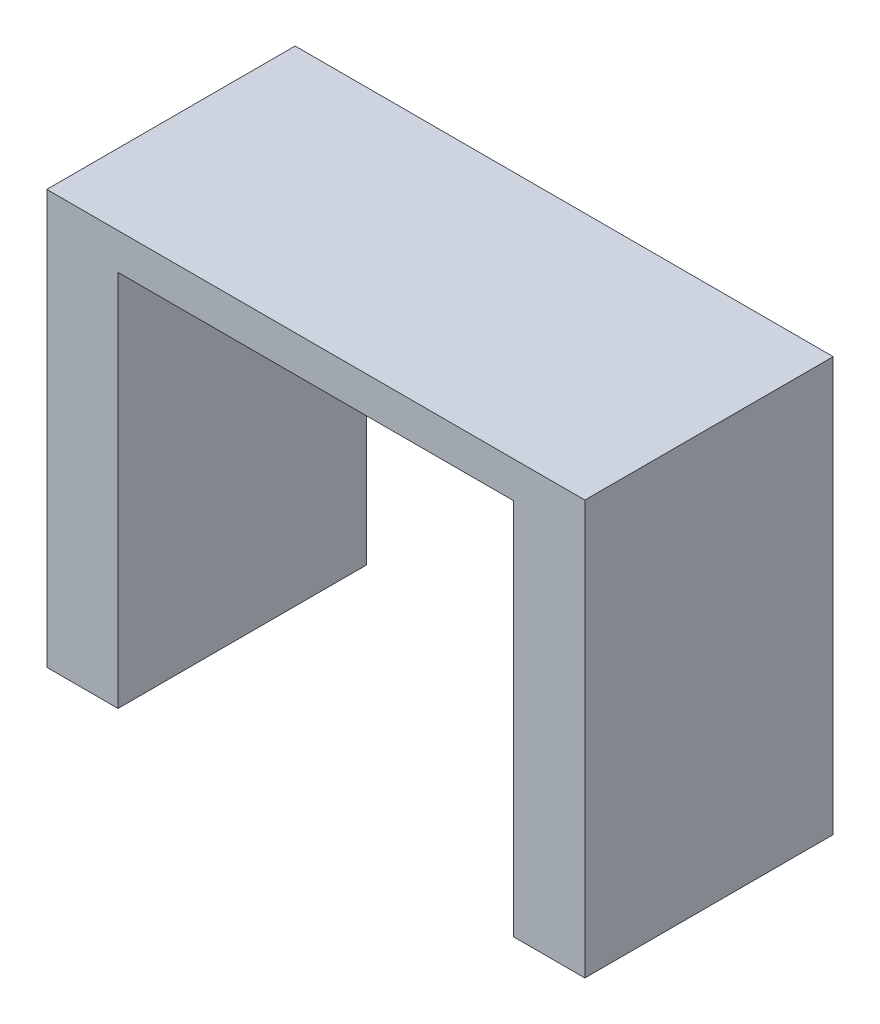
ISO-10303-21;
HEADER;
FILE_DESCRIPTION(('STEP AP214'),'2;1');
FILE_NAME('part.step','',(''),(''),'','','');
FILE_SCHEMA(('AUTOMOTIVE_DESIGN { 1 0 10303 214 1 1 1 1 }'));
ENDSEC;
DATA;
#1=APPLICATION_CONTEXT('core data for automotive mechanical design processes');
#2=APPLICATION_PROTOCOL_DEFINITION('international standard','automotive_design',2000,#1);
#3=PRODUCT_CONTEXT('',#1,'mechanical');
#4=PRODUCT('Part','Part','',(#3));
#5=PRODUCT_RELATED_PRODUCT_CATEGORY('part','',(#4));
#6=PRODUCT_DEFINITION_FORMATION('','',#4);
#7=PRODUCT_DEFINITION_CONTEXT('part definition',#1,'design');
#8=PRODUCT_DEFINITION('design','',#6,#7);
#9=PRODUCT_DEFINITION_SHAPE('','',#8);
#10=(LENGTH_UNIT() NAMED_UNIT(*) SI_UNIT(.MILLI.,.METRE.));
#11=(NAMED_UNIT(*) PLANE_ANGLE_UNIT() SI_UNIT($,.RADIAN.));
#12=(NAMED_UNIT(*) SI_UNIT($,.STERADIAN.) SOLID_ANGLE_UNIT());
#13=UNCERTAINTY_MEASURE_WITH_UNIT(LENGTH_MEASURE(1.E-05),#10,'distance_accuracy_value','');
#14=(GEOMETRIC_REPRESENTATION_CONTEXT(3) GLOBAL_UNCERTAINTY_ASSIGNED_CONTEXT((#13)) GLOBAL_UNIT_ASSIGNED_CONTEXT((#10,
#11,#12)) REPRESENTATION_CONTEXT('',''));
#15=CARTESIAN_POINT('',(0.,0.,0.));
#16=DIRECTION('',(0.,0.,1.));
#17=DIRECTION('',(1.,0.,0.));
#18=AXIS2_PLACEMENT_3D('',#15,#16,#17);
#19=CARTESIAN_POINT('',(0.,0.,0.));
#20=DIRECTION('',(0.,-1.,0.));
#21=DIRECTION('',(0.,0.,-1.));
#22=AXIS2_PLACEMENT_3D('',#19,#20,#21);
#23=PLANE('',#22);
#24=DIRECTION('',(0.,0.,1.));
#25=VECTOR('',#24,1.);
#26=CARTESIAN_POINT('',(4.77865012048486,0.,0.));
#27=LINE('',#26,#25);
#28=CARTESIAN_POINT('',(4.77865012048486,0.,-3.));
#29=VERTEX_POINT('',#28);
#30=CARTESIAN_POINT('',(4.77865012048486,0.,3.));
#31=VERTEX_POINT('',#30);
#32=EDGE_CURVE('E11',#29,#31,#27,.T.);
#33=ORIENTED_EDGE('',*,*,#32,.F.);
#34=DIRECTION('',(-1.,0.,0.));
#35=VECTOR('',#34,1.);
#36=CARTESIAN_POINT('',(-6.5,0.,-3.));
#37=LINE('',#36,#35);
#38=CARTESIAN_POINT('',(6.5,0.,-3.));
#39=VERTEX_POINT('',#38);
#40=EDGE_CURVE('E147',#39,#29,#37,.T.);
#41=ORIENTED_EDGE('',*,*,#40,.F.);
#42=DIRECTION('',(0.,0.,-1.));
#43=VECTOR('',#42,1.);
#44=CARTESIAN_POINT('',(6.5,0.,3.));
#45=LINE('',#44,#43);
#46=CARTESIAN_POINT('',(6.5,0.,3.));
#47=VERTEX_POINT('',#46);
#48=EDGE_CURVE('E135',#47,#39,#45,.T.);
#49=ORIENTED_EDGE('',*,*,#48,.F.);
#50=DIRECTION('',(1.,0.,0.));
#51=VECTOR('',#50,1.);
#52=CARTESIAN_POINT('',(-6.5,0.,3.));
#53=LINE('',#52,#51);
#54=EDGE_CURVE('E78',#31,#47,#53,.T.);
#55=ORIENTED_EDGE('',*,*,#54,.F.);
#56=EDGE_LOOP('',(#33,#41,#49,#55));
#57=FACE_BOUND('',#56,.T.);
#58=ADVANCED_FACE('F33',(#57),#23,.T.);
#59=CARTESIAN_POINT('',(6.5,10.,3.));
#60=DIRECTION('',(-1.,0.,0.));
#61=DIRECTION('',(0.,0.,1.));
#62=AXIS2_PLACEMENT_3D('',#59,#60,#61);
#63=PLANE('',#62);
#64=ORIENTED_EDGE('',*,*,#48,.T.);
#65=DIRECTION('',(0.,-1.,0.));
#66=VECTOR('',#65,1.);
#67=CARTESIAN_POINT('',(6.5,10.,-3.));
#68=LINE('',#67,#66);
#69=CARTESIAN_POINT('',(6.5,10.,-3.));
#70=VERTEX_POINT('',#69);
#71=EDGE_CURVE('E160',#70,#39,#68,.T.);
#72=ORIENTED_EDGE('',*,*,#71,.F.);
#73=DIRECTION('',(0.,0.,-1.));
#74=VECTOR('',#73,1.);
#75=CARTESIAN_POINT('',(6.5,10.,3.));
#76=LINE('',#75,#74);
#77=CARTESIAN_POINT('',(6.5,10.,3.));
#78=VERTEX_POINT('',#77);
#79=EDGE_CURVE('E136',#78,#70,#76,.T.);
#80=ORIENTED_EDGE('',*,*,#79,.F.);
#81=DIRECTION('',(0.,-1.,0.));
#82=VECTOR('',#81,1.);
#83=CARTESIAN_POINT('',(6.5,10.,3.));
#84=LINE('',#83,#82);
#85=EDGE_CURVE('E143',#78,#47,#84,.T.);
#86=ORIENTED_EDGE('',*,*,#85,.T.);
#87=EDGE_LOOP('',(#64,#72,#80,#86));
#88=FACE_BOUND('',#87,.T.);
#89=ADVANCED_FACE('F35',(#88),#63,.F.);
#90=CARTESIAN_POINT('',(-6.5,10.,-3.));
#91=DIRECTION('',(0.,0.,1.));
#92=DIRECTION('',(1.,0.,0.));
#93=AXIS2_PLACEMENT_3D('',#90,#91,#92);
#94=PLANE('',#93);
#95=ORIENTED_EDGE('',*,*,#40,.T.);
#96=DIRECTION('',(0.,1.,0.));
#97=VECTOR('',#96,1.);
#98=CARTESIAN_POINT('',(4.77865012048486,10.,-3.));
#99=LINE('',#98,#97);
#100=CARTESIAN_POINT('',(4.77865012048486,9.1244088288553,-3.));
#101=VERTEX_POINT('',#100);
#102=EDGE_CURVE('E132',#29,#101,#99,.T.);
#103=ORIENTED_EDGE('',*,*,#102,.T.);
#104=DIRECTION('',(-1.,0.,0.));
#105=VECTOR('',#104,1.);
#106=CARTESIAN_POINT('',(-6.5,9.1244088288553,-3.));
#107=LINE('',#106,#105);
#108=CARTESIAN_POINT('',(-4.77865012048486,9.1244088288553,-3.));
#109=VERTEX_POINT('',#108);
#110=EDGE_CURVE('E114',#101,#109,#107,.T.);
#111=ORIENTED_EDGE('',*,*,#110,.T.);
#112=DIRECTION('',(0.,-1.,0.));
#113=VECTOR('',#112,1.);
#114=CARTESIAN_POINT('',(-4.77865012048486,10.,-3.));
#115=LINE('',#114,#113);
#116=CARTESIAN_POINT('',(-4.77865012048486,0.,-3.));
#117=VERTEX_POINT('',#116);
#118=EDGE_CURVE('E128',#109,#117,#115,.T.);
#119=ORIENTED_EDGE('',*,*,#118,.T.);
#120=CARTESIAN_POINT('',(-6.5,0.,-3.));
#121=VERTEX_POINT('',#120);
#122=EDGE_CURVE('E146',#117,#121,#37,.T.);
#123=ORIENTED_EDGE('',*,*,#122,.T.);
#124=DIRECTION('',(0.,-1.,0.));
#125=VECTOR('',#124,1.);
#126=CARTESIAN_POINT('',(-6.5,10.,-3.));
#127=LINE('',#126,#125);
#128=CARTESIAN_POINT('',(-6.5,10.,-3.));
#129=VERTEX_POINT('',#128);
#130=EDGE_CURVE('E157',#129,#121,#127,.T.);
#131=ORIENTED_EDGE('',*,*,#130,.F.);
#132=DIRECTION('',(-1.,0.,0.));
#133=VECTOR('',#132,1.);
#134=CARTESIAN_POINT('',(-6.5,10.,-3.));
#135=LINE('',#134,#133);
#136=EDGE_CURVE('E86',#70,#129,#135,.T.);
#137=ORIENTED_EDGE('',*,*,#136,.F.);
#138=ORIENTED_EDGE('',*,*,#71,.T.);
#139=EDGE_LOOP('',(#95,#103,#111,#119,#123,#131,#137,#138));
#140=FACE_BOUND('',#139,.T.);
#141=ADVANCED_FACE('F165',(#140),#94,.F.);
#142=CARTESIAN_POINT('',(-6.5,10.,3.));
#143=DIRECTION('',(1.,0.,0.));
#144=DIRECTION('',(0.,0.,-1.));
#145=AXIS2_PLACEMENT_3D('',#142,#143,#144);
#146=PLANE('',#145);
#147=DIRECTION('',(0.,0.,1.));
#148=VECTOR('',#147,1.);
#149=CARTESIAN_POINT('',(-6.5,0.,3.));
#150=LINE('',#149,#148);
#151=CARTESIAN_POINT('',(-6.5,0.,3.));
#152=VERTEX_POINT('',#151);
#153=EDGE_CURVE('E150',#121,#152,#150,.T.);
#154=ORIENTED_EDGE('',*,*,#153,.T.);
#155=DIRECTION('',(0.,-1.,0.));
#156=VECTOR('',#155,1.);
#157=CARTESIAN_POINT('',(-6.5,10.,3.));
#158=LINE('',#157,#156);
#159=CARTESIAN_POINT('',(-6.5,10.,3.));
#160=VERTEX_POINT('',#159);
#161=EDGE_CURVE('E154',#160,#152,#158,.T.);
#162=ORIENTED_EDGE('',*,*,#161,.F.);
#163=DIRECTION('',(0.,0.,1.));
#164=VECTOR('',#163,1.);
#165=CARTESIAN_POINT('',(-6.5,10.,3.));
#166=LINE('',#165,#164);
#167=EDGE_CURVE('E140',#129,#160,#166,.T.);
#168=ORIENTED_EDGE('',*,*,#167,.F.);
#169=ORIENTED_EDGE('',*,*,#130,.T.);
#170=EDGE_LOOP('',(#154,#162,#168,#169));
#171=FACE_BOUND('',#170,.T.);
#172=ADVANCED_FACE('F170',(#171),#146,.F.);
#173=CARTESIAN_POINT('',(-6.5,10.,3.));
#174=DIRECTION('',(0.,0.,-1.));
#175=DIRECTION('',(-1.,0.,0.));
#176=AXIS2_PLACEMENT_3D('',#173,#174,#175);
#177=PLANE('',#176);
#178=DIRECTION('',(-1.,0.,0.));
#179=VECTOR('',#178,1.);
#180=CARTESIAN_POINT('',(-4.77865012048486,9.1244088288553,3.));
#181=LINE('',#180,#179);
#182=CARTESIAN_POINT('',(4.77865012048486,9.1244088288553,3.));
#183=VERTEX_POINT('',#182);
#184=CARTESIAN_POINT('',(-4.77865012048486,9.1244088288553,3.));
#185=VERTEX_POINT('',#184);
#186=EDGE_CURVE('E112',#183,#185,#181,.T.);
#187=ORIENTED_EDGE('',*,*,#186,.F.);
#188=DIRECTION('',(0.,1.,0.));
#189=VECTOR('',#188,1.);
#190=CARTESIAN_POINT('',(4.77865012048486,9.1244088288553,3.));
#191=LINE('',#190,#189);
#192=EDGE_CURVE('E119',#31,#183,#191,.T.);
#193=ORIENTED_EDGE('',*,*,#192,.F.);
#194=ORIENTED_EDGE('',*,*,#54,.T.);
#195=ORIENTED_EDGE('',*,*,#85,.F.);
#196=DIRECTION('',(1.,0.,0.));
#197=VECTOR('',#196,1.);
#198=CARTESIAN_POINT('',(-6.5,10.,3.));
#199=LINE('',#198,#197);
#200=EDGE_CURVE('E57',#160,#78,#199,.T.);
#201=ORIENTED_EDGE('',*,*,#200,.F.);
#202=ORIENTED_EDGE('',*,*,#161,.T.);
#203=CARTESIAN_POINT('',(-4.77865012048486,0.,3.));
#204=VERTEX_POINT('',#203);
#205=EDGE_CURVE('E138',#152,#204,#53,.T.);
#206=ORIENTED_EDGE('',*,*,#205,.T.);
#207=DIRECTION('',(0.,-1.,0.));
#208=VECTOR('',#207,1.);
#209=CARTESIAN_POINT('',(-4.77865012048486,9.1244088288553,3.));
#210=LINE('',#209,#208);
#211=EDGE_CURVE('E48',#185,#204,#210,.T.);
#212=ORIENTED_EDGE('',*,*,#211,.F.);
#213=EDGE_LOOP('',(#187,#193,#194,#195,#201,#202,#206,#212));
#214=FACE_BOUND('',#213,.T.);
#215=ADVANCED_FACE('F123',(#214),#177,.F.);
#216=CARTESIAN_POINT('',(0.,10.,0.));
#217=DIRECTION('',(0.,-1.,0.));
#218=DIRECTION('',(0.,0.,-1.));
#219=AXIS2_PLACEMENT_3D('',#216,#217,#218);
#220=PLANE('',#219);
#221=ORIENTED_EDGE('',*,*,#79,.T.);
#222=ORIENTED_EDGE('',*,*,#136,.T.);
#223=ORIENTED_EDGE('',*,*,#167,.T.);
#224=ORIENTED_EDGE('',*,*,#200,.T.);
#225=EDGE_LOOP('',(#221,#222,#223,#224));
#226=FACE_BOUND('',#225,.T.);
#227=ADVANCED_FACE('F176',(#226),#220,.F.);
#228=DIRECTION('',(0.,0.,-1.));
#229=VECTOR('',#228,1.);
#230=CARTESIAN_POINT('',(-4.77865012048486,0.,0.));
#231=LINE('',#230,#229);
#232=EDGE_CURVE('E41',#204,#117,#231,.T.);
#233=ORIENTED_EDGE('',*,*,#232,.F.);
#234=ORIENTED_EDGE('',*,*,#205,.F.);
#235=ORIENTED_EDGE('',*,*,#153,.F.);
#236=ORIENTED_EDGE('',*,*,#122,.F.);
#237=EDGE_LOOP('',(#233,#234,#235,#236));
#238=FACE_BOUND('',#237,.T.);
#239=ADVANCED_FACE('F167',(#238),#23,.T.);
#240=CARTESIAN_POINT('',(-4.77865012048486,9.1244088288553,-7.));
#241=DIRECTION('',(0.,1.,0.));
#242=DIRECTION('',(0.,0.,1.));
#243=AXIS2_PLACEMENT_3D('',#240,#241,#242);
#244=PLANE('',#243);
#245=DIRECTION('',(0.,0.,1.));
#246=VECTOR('',#245,1.);
#247=CARTESIAN_POINT('',(4.77865012048486,9.1244088288553,-7.));
#248=LINE('',#247,#246);
#249=EDGE_CURVE('E107',#101,#183,#248,.T.);
#250=ORIENTED_EDGE('',*,*,#249,.T.);
#251=ORIENTED_EDGE('',*,*,#186,.T.);
#252=DIRECTION('',(0.,0.,1.));
#253=VECTOR('',#252,1.);
#254=CARTESIAN_POINT('',(-4.77865012048486,9.1244088288553,-7.));
#255=LINE('',#254,#253);
#256=EDGE_CURVE('E117',#109,#185,#255,.T.);
#257=ORIENTED_EDGE('',*,*,#256,.F.);
#258=ORIENTED_EDGE('',*,*,#110,.F.);
#259=EDGE_LOOP('',(#250,#251,#257,#258));
#260=FACE_BOUND('',#259,.T.);
#261=ADVANCED_FACE('F109',(#260),#244,.F.);
#262=CARTESIAN_POINT('',(4.77865012048486,9.1244088288553,-7.));
#263=DIRECTION('',(1.,0.,0.));
#264=DIRECTION('',(0.,0.,-1.));
#265=AXIS2_PLACEMENT_3D('',#262,#263,#264);
#266=PLANE('',#265);
#267=ORIENTED_EDGE('',*,*,#32,.T.);
#268=ORIENTED_EDGE('',*,*,#192,.T.);
#269=ORIENTED_EDGE('',*,*,#249,.F.);
#270=ORIENTED_EDGE('',*,*,#102,.F.);
#271=EDGE_LOOP('',(#267,#268,#269,#270));
#272=FACE_BOUND('',#271,.T.);
#273=ADVANCED_FACE('F120',(#272),#266,.F.);
#274=CARTESIAN_POINT('',(-4.77865012048486,9.1244088288553,-7.));
#275=DIRECTION('',(-1.,0.,0.));
#276=DIRECTION('',(0.,0.,1.));
#277=AXIS2_PLACEMENT_3D('',#274,#275,#276);
#278=PLANE('',#277);
#279=ORIENTED_EDGE('',*,*,#256,.T.);
#280=ORIENTED_EDGE('',*,*,#211,.T.);
#281=ORIENTED_EDGE('',*,*,#232,.T.);
#282=ORIENTED_EDGE('',*,*,#118,.F.);
#283=EDGE_LOOP('',(#279,#280,#281,#282));
#284=FACE_BOUND('',#283,.T.);
#285=ADVANCED_FACE('F161',(#284),#278,.F.);
#286=CLOSED_SHELL('',(#58,#89,#141,#172,#215,#227,#239,#261,#273,#285));
#287=MANIFOLD_SOLID_BREP('B2',#286);
#288=ADVANCED_BREP_SHAPE_REPRESENTATION('',(#18,#287),#14);
#289=SHAPE_DEFINITION_REPRESENTATION(#9,#288);
ENDSEC;
END-ISO-10303-21;
